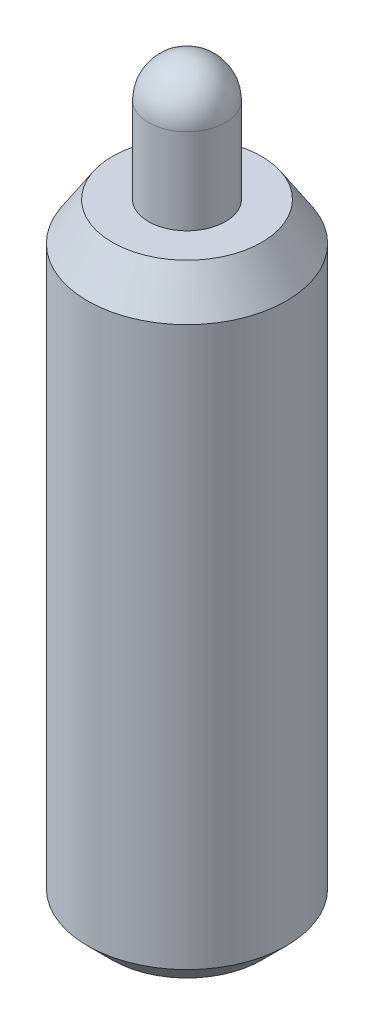
ISO-10303-21;
HEADER;
FILE_DESCRIPTION(('STEP AP214'),'2;1');
FILE_NAME('part.step','',(''),(''),'','','');
FILE_SCHEMA(('AUTOMOTIVE_DESIGN { 1 0 10303 214 1 1 1 1 }'));
ENDSEC;
DATA;
#1=APPLICATION_CONTEXT('core data for automotive mechanical design processes');
#2=APPLICATION_PROTOCOL_DEFINITION('international standard','automotive_design',2000,#1);
#3=PRODUCT_CONTEXT('',#1,'mechanical');
#4=PRODUCT('Part','Part','',(#3));
#5=PRODUCT_RELATED_PRODUCT_CATEGORY('part','',(#4));
#6=PRODUCT_DEFINITION_FORMATION('','',#4);
#7=PRODUCT_DEFINITION_CONTEXT('part definition',#1,'design');
#8=PRODUCT_DEFINITION('design','',#6,#7);
#9=PRODUCT_DEFINITION_SHAPE('','',#8);
#10=(LENGTH_UNIT() NAMED_UNIT(*) SI_UNIT(.MILLI.,.METRE.));
#11=(NAMED_UNIT(*) PLANE_ANGLE_UNIT() SI_UNIT($,.RADIAN.));
#12=(NAMED_UNIT(*) SI_UNIT($,.STERADIAN.) SOLID_ANGLE_UNIT());
#13=UNCERTAINTY_MEASURE_WITH_UNIT(LENGTH_MEASURE(1.E-05),#10,'distance_accuracy_value','');
#14=(GEOMETRIC_REPRESENTATION_CONTEXT(3) GLOBAL_UNCERTAINTY_ASSIGNED_CONTEXT((#13)) GLOBAL_UNIT_ASSIGNED_CONTEXT((#10,
#11,#12)) REPRESENTATION_CONTEXT('',''));
#15=CARTESIAN_POINT('',(0.,0.,0.));
#16=DIRECTION('',(0.,0.,1.));
#17=DIRECTION('',(1.,0.,0.));
#18=AXIS2_PLACEMENT_3D('',#15,#16,#17);
#19=CARTESIAN_POINT('',(0.,3.44999999999999,0.));
#20=DIRECTION('',(0.,1.,0.));
#21=DIRECTION('',(0.,0.,1.));
#22=AXIS2_PLACEMENT_3D('',#19,#20,#21);
#23=SPHERICAL_SURFACE('',#22,1.55000000000001);
#24=CARTESIAN_POINT('',(0.,3.44999999999999,0.));
#25=DIRECTION('',(0.,1.,0.));
#26=DIRECTION('',(0.,0.,1.));
#27=AXIS2_PLACEMENT_3D('',#24,#25,#26);
#28=CIRCLE('',#27,1.54999999999999);
#29=CARTESIAN_POINT('',(0.,3.44999999999999,1.54999999999999));
#30=VERTEX_POINT('',#29);
#31=EDGE_CURVE('E10',#30,#30,#28,.T.);
#32=ORIENTED_EDGE('',*,*,#31,.T.);
#33=EDGE_LOOP('',(#32));
#34=FACE_BOUND('',#33,.T.);
#35=ADVANCED_FACE('F33',(#34),#23,.T.);
#36=CARTESIAN_POINT('',(0.,46.2984024863754,0.));
#37=DIRECTION('',(0.,1.,0.));
#38=DIRECTION('',(0.,0.,1.));
#39=AXIS2_PLACEMENT_3D('',#36,#37,#38);
#40=CYLINDRICAL_SURFACE('',#39,1.54999999999999);
#41=CARTESIAN_POINT('',(0.,0.,0.));
#42=DIRECTION('',(0.,1.,0.));
#43=DIRECTION('',(0.,0.,1.));
#44=AXIS2_PLACEMENT_3D('',#41,#42,#43);
#45=CIRCLE('',#44,1.54999999999999);
#46=CARTESIAN_POINT('',(0.,0.,1.54999999999999));
#47=VERTEX_POINT('',#46);
#48=EDGE_CURVE('E39',#47,#47,#45,.T.);
#49=ORIENTED_EDGE('',*,*,#48,.T.);
#50=EDGE_LOOP('',(#49));
#51=FACE_BOUND('',#50,.T.);
#52=ORIENTED_EDGE('',*,*,#31,.F.);
#53=EDGE_LOOP('',(#52));
#54=FACE_BOUND('',#53,.T.);
#55=ADVANCED_FACE('F71',(#51,#54),#40,.T.);
#56=CARTESIAN_POINT('',(0.,0.,3.));
#57=DIRECTION('',(0.,1.,0.));
#58=DIRECTION('',(0.,0.,1.));
#59=AXIS2_PLACEMENT_3D('',#56,#57,#58);
#60=PLANE('',#59);
#61=CARTESIAN_POINT('',(0.,0.,0.));
#62=DIRECTION('',(0.,1.,0.));
#63=DIRECTION('',(0.,0.,1.));
#64=AXIS2_PLACEMENT_3D('',#61,#62,#63);
#65=CIRCLE('',#64,3.);
#66=CARTESIAN_POINT('',(0.,0.,3.));
#67=VERTEX_POINT('',#66);
#68=EDGE_CURVE('E43',#67,#67,#65,.T.);
#69=ORIENTED_EDGE('',*,*,#68,.T.);
#70=EDGE_LOOP('',(#69));
#71=FACE_BOUND('',#70,.T.);
#72=ORIENTED_EDGE('',*,*,#48,.F.);
#73=EDGE_LOOP('',(#72));
#74=FACE_BOUND('',#73,.T.);
#75=ADVANCED_FACE('F75',(#71,#74),#60,.T.);
#76=CARTESIAN_POINT('',(0.,0.,0.));
#77=DIRECTION('',(0.,-1.,0.));
#78=DIRECTION('',(0.,0.,-1.));
#79=AXIS2_PLACEMENT_3D('',#76,#77,#78);
#80=CONICAL_SURFACE('',#79,3.,0.576904487558146);
#81=CARTESIAN_POINT('',(0.,-1.53668101824875,0.));
#82=DIRECTION('',(0.,1.,0.));
#83=DIRECTION('',(0.,0.,1.));
#84=AXIS2_PLACEMENT_3D('',#81,#82,#83);
#85=CIRCLE('',#84,3.99999999999999);
#86=CARTESIAN_POINT('',(0.,-1.53668101824875,3.99999999999999));
#87=VERTEX_POINT('',#86);
#88=EDGE_CURVE('E47',#87,#87,#85,.T.);
#89=ORIENTED_EDGE('',*,*,#88,.T.);
#90=EDGE_LOOP('',(#89));
#91=FACE_BOUND('',#90,.T.);
#92=ORIENTED_EDGE('',*,*,#68,.F.);
#93=EDGE_LOOP('',(#92));
#94=FACE_BOUND('',#93,.T.);
#95=ADVANCED_FACE('F79',(#91,#94),#80,.T.);
#96=CARTESIAN_POINT('',(0.,46.2984024863754,0.));
#97=DIRECTION('',(0.,1.,0.));
#98=DIRECTION('',(0.,0.,1.));
#99=AXIS2_PLACEMENT_3D('',#96,#97,#98);
#100=CYLINDRICAL_SURFACE('',#99,3.99999999999999);
#101=CARTESIAN_POINT('',(0.,-24.,0.));
#102=DIRECTION('',(0.,1.,0.));
#103=DIRECTION('',(0.,0.,1.));
#104=AXIS2_PLACEMENT_3D('',#101,#102,#103);
#105=CIRCLE('',#104,3.99999999999999);
#106=CARTESIAN_POINT('',(0.,-24.,3.99999999999999));
#107=VERTEX_POINT('',#106);
#108=EDGE_CURVE('E52',#107,#107,#105,.T.);
#109=ORIENTED_EDGE('',*,*,#108,.T.);
#110=EDGE_LOOP('',(#109));
#111=FACE_BOUND('',#110,.T.);
#112=ORIENTED_EDGE('',*,*,#88,.F.);
#113=EDGE_LOOP('',(#112));
#114=FACE_BOUND('',#113,.T.);
#115=ADVANCED_FACE('F68',(#111,#114),#100,.T.);
#116=CARTESIAN_POINT('',(0.,-24.,0.));
#117=DIRECTION('',(0.,1.,0.));
#118=DIRECTION('',(0.,0.,1.));
#119=AXIS2_PLACEMENT_3D('',#116,#117,#118);
#120=CONICAL_SURFACE('',#119,3.99999999999999,0.785398163397444);
#121=CARTESIAN_POINT('',(0.,-25.,0.));
#122=DIRECTION('',(0.,1.,0.));
#123=DIRECTION('',(0.,0.,1.));
#124=AXIS2_PLACEMENT_3D('',#121,#122,#123);
#125=CIRCLE('',#124,3.);
#126=CARTESIAN_POINT('',(0.,-25.,3.));
#127=VERTEX_POINT('',#126);
#128=EDGE_CURVE('E55',#127,#127,#125,.T.);
#129=ORIENTED_EDGE('',*,*,#128,.T.);
#130=EDGE_LOOP('',(#129));
#131=FACE_BOUND('',#130,.T.);
#132=ORIENTED_EDGE('',*,*,#108,.F.);
#133=EDGE_LOOP('',(#132));
#134=FACE_BOUND('',#133,.T.);
#135=ADVANCED_FACE('F59',(#131,#134),#120,.T.);
#136=CARTESIAN_POINT('',(0.,-25.,3.));
#137=DIRECTION('',(0.,-1.,0.));
#138=DIRECTION('',(0.,0.,-1.));
#139=AXIS2_PLACEMENT_3D('',#136,#137,#138);
#140=PLANE('',#139);
#141=ORIENTED_EDGE('',*,*,#128,.F.);
#142=EDGE_LOOP('',(#141));
#143=FACE_BOUND('',#142,.T.);
#144=ADVANCED_FACE('F62',(#143),#140,.T.);
#145=CLOSED_SHELL('',(#35,#55,#75,#95,#115,#135,#144));
#146=MANIFOLD_SOLID_BREP('B2',#145);
#147=ADVANCED_BREP_SHAPE_REPRESENTATION('',(#18,#146),#14);
#148=SHAPE_DEFINITION_REPRESENTATION(#9,#147);
ENDSEC;
END-ISO-10303-21;
